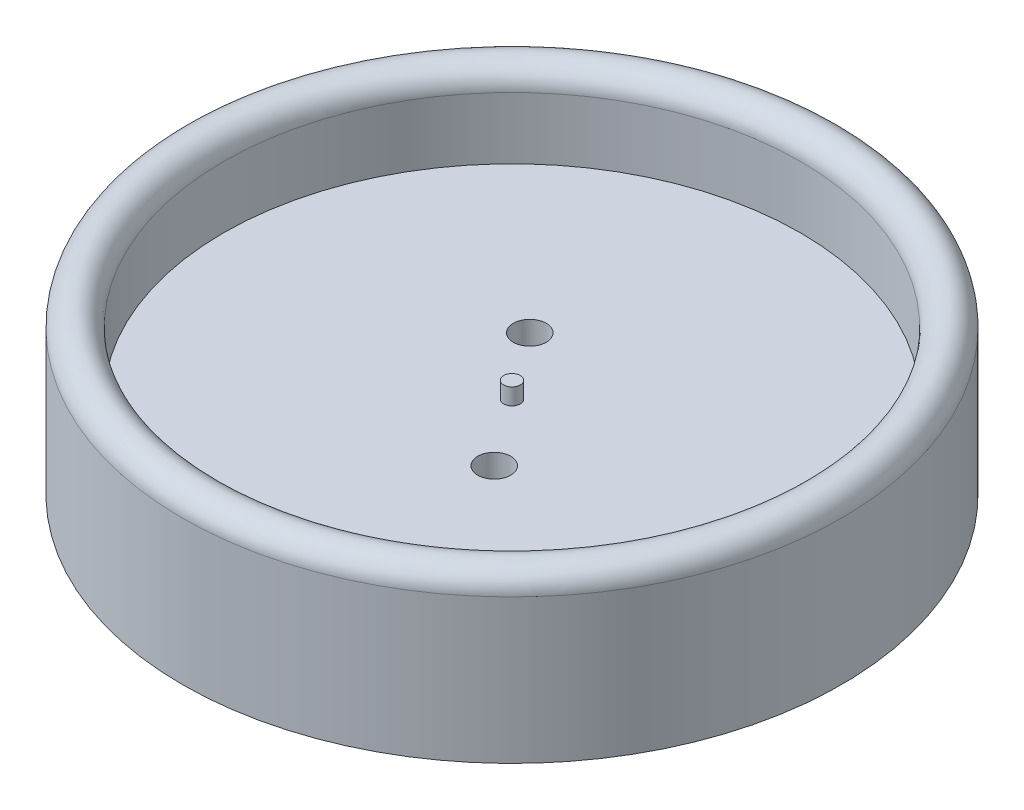
ISO-10303-21;
HEADER;
FILE_DESCRIPTION(('STEP AP214'),'2;1');
FILE_NAME('part.step','',(''),(''),'','','');
FILE_SCHEMA(('AUTOMOTIVE_DESIGN { 1 0 10303 214 1 1 1 1 }'));
ENDSEC;
DATA;
#1=APPLICATION_CONTEXT('core data for automotive mechanical design processes');
#2=APPLICATION_PROTOCOL_DEFINITION('international standard','automotive_design',2000,#1);
#3=PRODUCT_CONTEXT('',#1,'mechanical');
#4=PRODUCT('Part','Part','',(#3));
#5=PRODUCT_RELATED_PRODUCT_CATEGORY('part','',(#4));
#6=PRODUCT_DEFINITION_FORMATION('','',#4);
#7=PRODUCT_DEFINITION_CONTEXT('part definition',#1,'design');
#8=PRODUCT_DEFINITION('design','',#6,#7);
#9=PRODUCT_DEFINITION_SHAPE('','',#8);
#10=(LENGTH_UNIT() NAMED_UNIT(*) SI_UNIT(.MILLI.,.METRE.));
#11=(NAMED_UNIT(*) PLANE_ANGLE_UNIT() SI_UNIT($,.RADIAN.));
#12=(NAMED_UNIT(*) SI_UNIT($,.STERADIAN.) SOLID_ANGLE_UNIT());
#13=UNCERTAINTY_MEASURE_WITH_UNIT(LENGTH_MEASURE(1.E-05),#10,'distance_accuracy_value','');
#14=(GEOMETRIC_REPRESENTATION_CONTEXT(3) GLOBAL_UNCERTAINTY_ASSIGNED_CONTEXT((#13)) GLOBAL_UNIT_ASSIGNED_CONTEXT((#10,
#11,#12)) REPRESENTATION_CONTEXT('',''));
#15=CARTESIAN_POINT('',(0.,0.,0.));
#16=DIRECTION('',(0.,0.,1.));
#17=DIRECTION('',(1.,0.,0.));
#18=AXIS2_PLACEMENT_3D('',#15,#16,#17);
#19=CARTESIAN_POINT('',(0.,17.5,0.));
#20=DIRECTION('',(0.,1.,0.));
#21=DIRECTION('',(0.,0.,1.));
#22=AXIS2_PLACEMENT_3D('',#19,#20,#21);
#23=TOROIDAL_SURFACE('',#22,37.5,2.49999999999999);
#24=CARTESIAN_POINT('',(0.,17.5,0.));
#25=DIRECTION('',(0.,1.,0.));
#26=DIRECTION('',(0.,0.,1.));
#27=AXIS2_PLACEMENT_3D('',#24,#25,#26);
#28=CIRCLE('',#27,40.);
#29=CARTESIAN_POINT('',(0.,17.5,40.));
#30=VERTEX_POINT('',#29);
#31=EDGE_CURVE('E40',#30,#30,#28,.F.);
#32=ORIENTED_EDGE('',*,*,#31,.F.);
#33=EDGE_LOOP('',(#32));
#34=FACE_BOUND('',#33,.T.);
#35=CARTESIAN_POINT('',(0.,17.5,0.));
#36=DIRECTION('',(0.,1.,0.));
#37=DIRECTION('',(0.,0.,1.));
#38=AXIS2_PLACEMENT_3D('',#35,#36,#37);
#39=CIRCLE('',#38,35.);
#40=CARTESIAN_POINT('',(0.,17.5,35.));
#41=VERTEX_POINT('',#40);
#42=EDGE_CURVE('E10',#41,#41,#39,.T.);
#43=ORIENTED_EDGE('',*,*,#42,.F.);
#44=EDGE_LOOP('',(#43));
#45=FACE_BOUND('',#44,.T.);
#46=ADVANCED_FACE('F33',(#34,#45),#23,.T.);
#47=CARTESIAN_POINT('',(-5.91038891268487,20.,-8.06643061712005));
#48=DIRECTION('',(0.,-1.,0.));
#49=DIRECTION('',(0.,0.,-1.));
#50=AXIS2_PLACEMENT_3D('',#47,#48,#49);
#51=CYLINDRICAL_SURFACE('',#50,2.);
#52=CARTESIAN_POINT('',(-5.91038891268487,4.5,-8.06643061712005));
#53=DIRECTION('',(0.,-1.,0.));
#54=DIRECTION('',(0.,0.,-1.));
#55=AXIS2_PLACEMENT_3D('',#52,#53,#54);
#56=CIRCLE('',#55,2.);
#57=CARTESIAN_POINT('',(-5.91038891268487,4.5,-10.0664306171201));
#58=VERTEX_POINT('',#57);
#59=EDGE_CURVE('E64',#58,#58,#56,.T.);
#60=ORIENTED_EDGE('',*,*,#59,.T.);
#61=EDGE_LOOP('',(#60));
#62=FACE_BOUND('',#61,.T.);
#63=CARTESIAN_POINT('',(-5.91038891268487,10.,-8.06643061712005));
#64=DIRECTION('',(0.,1.,0.));
#65=DIRECTION('',(0.,0.,1.));
#66=AXIS2_PLACEMENT_3D('',#63,#64,#65);
#67=CIRCLE('',#66,2.);
#68=CARTESIAN_POINT('',(-5.91038891268487,10.,-6.06643061712005));
#69=VERTEX_POINT('',#68);
#70=EDGE_CURVE('E68',#69,#69,#67,.T.);
#71=ORIENTED_EDGE('',*,*,#70,.T.);
#72=EDGE_LOOP('',(#71));
#73=FACE_BOUND('',#72,.T.);
#74=ADVANCED_FACE('F122',(#62,#73),#51,.F.);
#75=CARTESIAN_POINT('',(5.91038891268487,20.,8.06643061712005));
#76=DIRECTION('',(0.,-1.,0.));
#77=DIRECTION('',(0.,0.,-1.));
#78=AXIS2_PLACEMENT_3D('',#75,#76,#77);
#79=CYLINDRICAL_SURFACE('',#78,2.);
#80=CARTESIAN_POINT('',(5.91038891268487,4.5,8.06643061712005));
#81=DIRECTION('',(0.,-1.,0.));
#82=DIRECTION('',(0.,0.,-1.));
#83=AXIS2_PLACEMENT_3D('',#80,#81,#82);
#84=CIRCLE('',#83,2.);
#85=CARTESIAN_POINT('',(5.91038891268487,4.5,6.06643061712005));
#86=VERTEX_POINT('',#85);
#87=EDGE_CURVE('E48',#86,#86,#84,.T.);
#88=ORIENTED_EDGE('',*,*,#87,.T.);
#89=EDGE_LOOP('',(#88));
#90=FACE_BOUND('',#89,.T.);
#91=CARTESIAN_POINT('',(5.91038891268487,10.,8.06643061712005));
#92=DIRECTION('',(0.,1.,0.));
#93=DIRECTION('',(0.,0.,1.));
#94=AXIS2_PLACEMENT_3D('',#91,#92,#93);
#95=CIRCLE('',#94,2.);
#96=CARTESIAN_POINT('',(5.91038891268487,10.,10.0664306171201));
#97=VERTEX_POINT('',#96);
#98=EDGE_CURVE('E71',#97,#97,#95,.T.);
#99=ORIENTED_EDGE('',*,*,#98,.T.);
#100=EDGE_LOOP('',(#99));
#101=FACE_BOUND('',#100,.T.);
#102=ADVANCED_FACE('F127',(#90,#101),#79,.F.);
#103=CARTESIAN_POINT('',(0.,10.,0.));
#104=DIRECTION('',(0.,-1.,0.));
#105=DIRECTION('',(0.,0.,-1.));
#106=AXIS2_PLACEMENT_3D('',#103,#104,#105);
#107=CYLINDRICAL_SURFACE('',#106,40.);
#108=ORIENTED_EDGE('',*,*,#31,.T.);
#109=EDGE_LOOP('',(#108));
#110=FACE_BOUND('',#109,.T.);
#111=CARTESIAN_POINT('',(0.,0.,0.));
#112=DIRECTION('',(0.,1.,0.));
#113=DIRECTION('',(0.,0.,1.));
#114=AXIS2_PLACEMENT_3D('',#111,#112,#113);
#115=CIRCLE('',#114,40.);
#116=CARTESIAN_POINT('',(0.,0.,40.));
#117=VERTEX_POINT('',#116);
#118=EDGE_CURVE('E75',#117,#117,#115,.T.);
#119=ORIENTED_EDGE('',*,*,#118,.T.);
#120=EDGE_LOOP('',(#119));
#121=FACE_BOUND('',#120,.T.);
#122=ADVANCED_FACE('F117',(#110,#121),#107,.T.);
#123=CARTESIAN_POINT('',(0.,0.,0.));
#124=DIRECTION('',(0.,1.,0.));
#125=DIRECTION('',(0.,0.,1.));
#126=AXIS2_PLACEMENT_3D('',#123,#124,#125);
#127=PLANE('',#126);
#128=CARTESIAN_POINT('',(-5.91038891268487,0.,-8.06643061712005));
#129=DIRECTION('',(0.,-1.,0.));
#130=DIRECTION('',(0.,0.,-1.));
#131=AXIS2_PLACEMENT_3D('',#128,#129,#130);
#132=CIRCLE('',#131,5.);
#133=CARTESIAN_POINT('',(-5.91038891268487,0.,-13.0664306171201));
#134=VERTEX_POINT('',#133);
#135=EDGE_CURVE('E61',#134,#134,#132,.T.);
#136=ORIENTED_EDGE('',*,*,#135,.F.);
#137=EDGE_LOOP('',(#136));
#138=FACE_BOUND('',#137,.T.);
#139=CARTESIAN_POINT('',(5.91038891268487,0.,8.06643061712005));
#140=DIRECTION('',(0.,-1.,0.));
#141=DIRECTION('',(0.,0.,-1.));
#142=AXIS2_PLACEMENT_3D('',#139,#140,#141);
#143=CIRCLE('',#142,5.);
#144=CARTESIAN_POINT('',(5.91038891268487,0.,3.06643061712005));
#145=VERTEX_POINT('',#144);
#146=EDGE_CURVE('E72',#145,#145,#143,.T.);
#147=ORIENTED_EDGE('',*,*,#146,.F.);
#148=EDGE_LOOP('',(#147));
#149=FACE_BOUND('',#148,.T.);
#150=ORIENTED_EDGE('',*,*,#118,.F.);
#151=EDGE_LOOP('',(#150));
#152=FACE_BOUND('',#151,.T.);
#153=ADVANCED_FACE('F112',(#138,#149,#152),#127,.F.);
#154=CARTESIAN_POINT('',(0.,20.,0.));
#155=DIRECTION('',(0.,-1.,0.));
#156=DIRECTION('',(0.,0.,-1.));
#157=AXIS2_PLACEMENT_3D('',#154,#155,#156);
#158=CYLINDRICAL_SURFACE('',#157,35.);
#159=ORIENTED_EDGE('',*,*,#42,.T.);
#160=EDGE_LOOP('',(#159));
#161=FACE_BOUND('',#160,.T.);
#162=CARTESIAN_POINT('',(0.,10.,0.));
#163=DIRECTION('',(0.,1.,0.));
#164=DIRECTION('',(0.,0.,1.));
#165=AXIS2_PLACEMENT_3D('',#162,#163,#164);
#166=CIRCLE('',#165,35.);
#167=CARTESIAN_POINT('',(0.,10.,35.));
#168=VERTEX_POINT('',#167);
#169=EDGE_CURVE('E67',#168,#168,#166,.F.);
#170=ORIENTED_EDGE('',*,*,#169,.T.);
#171=EDGE_LOOP('',(#170));
#172=FACE_BOUND('',#171,.T.);
#173=ADVANCED_FACE('F103',(#161,#172),#158,.F.);
#174=CARTESIAN_POINT('',(0.,10.,0.));
#175=DIRECTION('',(0.,1.,0.));
#176=DIRECTION('',(0.,0.,1.));
#177=AXIS2_PLACEMENT_3D('',#174,#175,#176);
#178=PLANE('',#177);
#179=CARTESIAN_POINT('',(0.,10.,0.));
#180=DIRECTION('',(0.,1.,0.));
#181=DIRECTION('',(0.,0.,1.));
#182=AXIS2_PLACEMENT_3D('',#179,#180,#181);
#183=CIRCLE('',#182,1.);
#184=CARTESIAN_POINT('',(0.,10.,1.));
#185=VERTEX_POINT('',#184);
#186=EDGE_CURVE('E84',#185,#185,#183,.T.);
#187=ORIENTED_EDGE('',*,*,#186,.F.);
#188=EDGE_LOOP('',(#187));
#189=FACE_BOUND('',#188,.T.);
#190=ORIENTED_EDGE('',*,*,#70,.F.);
#191=EDGE_LOOP('',(#190));
#192=FACE_BOUND('',#191,.T.);
#193=ORIENTED_EDGE('',*,*,#98,.F.);
#194=EDGE_LOOP('',(#193));
#195=FACE_BOUND('',#194,.T.);
#196=ORIENTED_EDGE('',*,*,#169,.F.);
#197=EDGE_LOOP('',(#196));
#198=FACE_BOUND('',#197,.T.);
#199=ADVANCED_FACE('F99',(#189,#192,#195,#198),#178,.T.);
#200=CARTESIAN_POINT('',(5.91038891268487,3.,8.06643061712005));
#201=DIRECTION('',(0.,-1.,0.));
#202=DIRECTION('',(0.,0.,-1.));
#203=AXIS2_PLACEMENT_3D('',#200,#201,#202);
#204=CYLINDRICAL_SURFACE('',#203,5.);
#205=CARTESIAN_POINT('',(5.91038891268487,1.5,8.06643061712005));
#206=DIRECTION('',(0.,-1.,0.));
#207=DIRECTION('',(0.,0.,-1.));
#208=AXIS2_PLACEMENT_3D('',#205,#206,#207);
#209=CIRCLE('',#208,5.);
#210=CARTESIAN_POINT('',(5.91038891268487,1.5,3.06643061712005));
#211=VERTEX_POINT('',#210);
#212=EDGE_CURVE('E44',#211,#211,#209,.F.);
#213=ORIENTED_EDGE('',*,*,#212,.T.);
#214=EDGE_LOOP('',(#213));
#215=FACE_BOUND('',#214,.T.);
#216=ORIENTED_EDGE('',*,*,#146,.T.);
#217=EDGE_LOOP('',(#216));
#218=FACE_BOUND('',#217,.T.);
#219=ADVANCED_FACE('F102',(#215,#218),#204,.F.);
#220=CARTESIAN_POINT('',(-5.91038891268487,3.,-8.06643061712005));
#221=DIRECTION('',(0.,-1.,0.));
#222=DIRECTION('',(0.,0.,-1.));
#223=AXIS2_PLACEMENT_3D('',#220,#221,#222);
#224=CYLINDRICAL_SURFACE('',#223,5.);
#225=CARTESIAN_POINT('',(-5.91038891268487,1.5,-8.06643061712005));
#226=DIRECTION('',(0.,-1.,0.));
#227=DIRECTION('',(0.,0.,-1.));
#228=AXIS2_PLACEMENT_3D('',#225,#226,#227);
#229=CIRCLE('',#228,5.);
#230=CARTESIAN_POINT('',(-5.91038891268487,1.5,-13.0664306171201));
#231=VERTEX_POINT('',#230);
#232=EDGE_CURVE('E58',#231,#231,#229,.F.);
#233=ORIENTED_EDGE('',*,*,#232,.T.);
#234=EDGE_LOOP('',(#233));
#235=FACE_BOUND('',#234,.T.);
#236=ORIENTED_EDGE('',*,*,#135,.T.);
#237=EDGE_LOOP('',(#236));
#238=FACE_BOUND('',#237,.T.);
#239=ADVANCED_FACE('F139',(#235,#238),#224,.F.);
#240=CARTESIAN_POINT('',(-5.91038891268487,1.5,-8.06643061712005));
#241=DIRECTION('',(0.,-1.,0.));
#242=DIRECTION('',(0.,0.,-1.));
#243=AXIS2_PLACEMENT_3D('',#240,#241,#242);
#244=TOROIDAL_SURFACE('',#243,3.5,1.5);
#245=ORIENTED_EDGE('',*,*,#232,.F.);
#246=EDGE_LOOP('',(#245));
#247=FACE_BOUND('',#246,.T.);
#248=CARTESIAN_POINT('',(-5.91038891268487,3.,-8.06643061712005));
#249=DIRECTION('',(0.,-1.,0.));
#250=DIRECTION('',(0.,0.,-1.));
#251=AXIS2_PLACEMENT_3D('',#248,#249,#250);
#252=CIRCLE('',#251,3.5);
#253=CARTESIAN_POINT('',(-5.91038891268487,3.,-11.5664306171201));
#254=VERTEX_POINT('',#253);
#255=EDGE_CURVE('E53',#254,#254,#252,.T.);
#256=ORIENTED_EDGE('',*,*,#255,.F.);
#257=EDGE_LOOP('',(#256));
#258=FACE_BOUND('',#257,.T.);
#259=ADVANCED_FACE('F142',(#247,#258),#244,.F.);
#260=CARTESIAN_POINT('',(-5.91038891268487,4.5,-8.06643061712005));
#261=DIRECTION('',(0.,-1.,0.));
#262=DIRECTION('',(0.,0.,-1.));
#263=AXIS2_PLACEMENT_3D('',#260,#261,#262);
#264=TOROIDAL_SURFACE('',#263,3.5,1.5);
#265=ORIENTED_EDGE('',*,*,#59,.F.);
#266=EDGE_LOOP('',(#265));
#267=FACE_BOUND('',#266,.T.);
#268=ORIENTED_EDGE('',*,*,#255,.T.);
#269=EDGE_LOOP('',(#268));
#270=FACE_BOUND('',#269,.T.);
#271=ADVANCED_FACE('F167',(#267,#270),#264,.T.);
#272=CARTESIAN_POINT('',(5.91038891268487,1.5,8.06643061712005));
#273=DIRECTION('',(0.,-1.,0.));
#274=DIRECTION('',(0.,0.,-1.));
#275=AXIS2_PLACEMENT_3D('',#272,#273,#274);
#276=TOROIDAL_SURFACE('',#275,3.5,1.5);
#277=ORIENTED_EDGE('',*,*,#212,.F.);
#278=EDGE_LOOP('',(#277));
#279=FACE_BOUND('',#278,.T.);
#280=CARTESIAN_POINT('',(5.91038891268487,3.,8.06643061712005));
#281=DIRECTION('',(0.,-1.,0.));
#282=DIRECTION('',(0.,0.,-1.));
#283=AXIS2_PLACEMENT_3D('',#280,#281,#282);
#284=CIRCLE('',#283,3.5);
#285=CARTESIAN_POINT('',(5.91038891268487,3.,4.56643061712005));
#286=VERTEX_POINT('',#285);
#287=EDGE_CURVE('E51',#286,#286,#284,.T.);
#288=ORIENTED_EDGE('',*,*,#287,.F.);
#289=EDGE_LOOP('',(#288));
#290=FACE_BOUND('',#289,.T.);
#291=ADVANCED_FACE('F159',(#279,#290),#276,.F.);
#292=CARTESIAN_POINT('',(5.91038891268487,4.5,8.06643061712005));
#293=DIRECTION('',(0.,-1.,0.));
#294=DIRECTION('',(0.,0.,-1.));
#295=AXIS2_PLACEMENT_3D('',#292,#293,#294);
#296=TOROIDAL_SURFACE('',#295,3.5,1.5);
#297=ORIENTED_EDGE('',*,*,#87,.F.);
#298=EDGE_LOOP('',(#297));
#299=FACE_BOUND('',#298,.T.);
#300=ORIENTED_EDGE('',*,*,#287,.T.);
#301=EDGE_LOOP('',(#300));
#302=FACE_BOUND('',#301,.T.);
#303=ADVANCED_FACE('F95',(#299,#302),#296,.T.);
#304=CARTESIAN_POINT('',(0.,12.,0.));
#305=DIRECTION('',(0.,-1.,0.));
#306=DIRECTION('',(0.,0.,-1.));
#307=AXIS2_PLACEMENT_3D('',#304,#305,#306);
#308=CYLINDRICAL_SURFACE('',#307,1.);
#309=CARTESIAN_POINT('',(0.,12.,0.));
#310=DIRECTION('',(0.,1.,0.));
#311=DIRECTION('',(0.,0.,1.));
#312=AXIS2_PLACEMENT_3D('',#309,#310,#311);
#313=CIRCLE('',#312,1.);
#314=CARTESIAN_POINT('',(0.,12.,1.));
#315=VERTEX_POINT('',#314);
#316=EDGE_CURVE('E54',#315,#315,#313,.T.);
#317=ORIENTED_EDGE('',*,*,#316,.F.);
#318=EDGE_LOOP('',(#317));
#319=FACE_BOUND('',#318,.T.);
#320=ORIENTED_EDGE('',*,*,#186,.T.);
#321=EDGE_LOOP('',(#320));
#322=FACE_BOUND('',#321,.T.);
#323=ADVANCED_FACE('F92',(#319,#322),#308,.T.);
#324=CARTESIAN_POINT('',(0.,12.,0.));
#325=DIRECTION('',(0.,1.,0.));
#326=DIRECTION('',(0.,0.,1.));
#327=AXIS2_PLACEMENT_3D('',#324,#325,#326);
#328=PLANE('',#327);
#329=ORIENTED_EDGE('',*,*,#316,.T.);
#330=EDGE_LOOP('',(#329));
#331=FACE_BOUND('',#330,.T.);
#332=ADVANCED_FACE('F90',(#331),#328,.T.);
#333=CLOSED_SHELL('',(#46,#74,#102,#122,#153,#173,#199,#219,#239,#259,#271,#291,#303,#323,#332));
#334=MANIFOLD_SOLID_BREP('B2',#333);
#335=ADVANCED_BREP_SHAPE_REPRESENTATION('',(#18,#334),#14);
#336=SHAPE_DEFINITION_REPRESENTATION(#9,#335);
ENDSEC;
END-ISO-10303-21;
